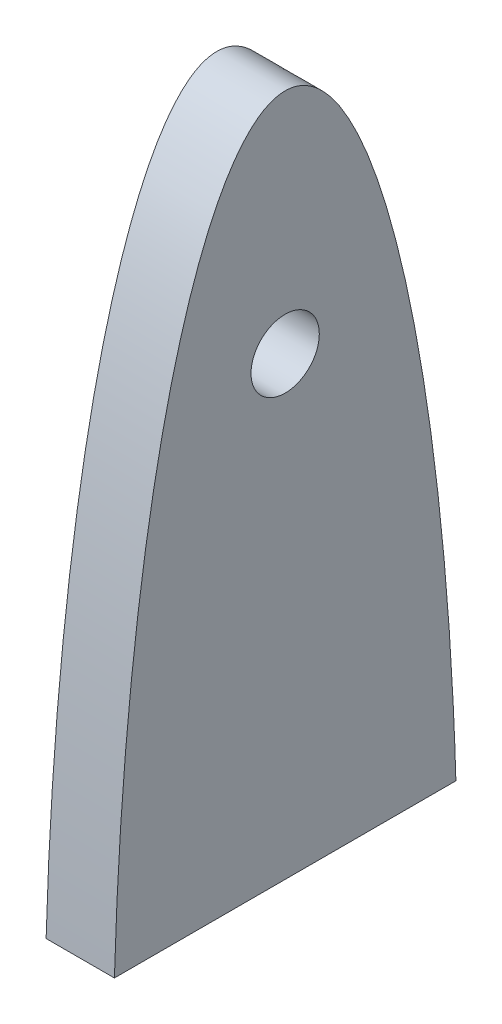
ISO-10303-21;
HEADER;
FILE_DESCRIPTION(('STEP AP214'),'2;1');
FILE_NAME('part.step','',(''),(''),'','','');
FILE_SCHEMA(('AUTOMOTIVE_DESIGN { 1 0 10303 214 1 1 1 1 }'));
ENDSEC;
DATA;
#1=APPLICATION_CONTEXT('core data for automotive mechanical design processes');
#2=APPLICATION_PROTOCOL_DEFINITION('international standard','automotive_design',2000,#1);
#3=PRODUCT_CONTEXT('',#1,'mechanical');
#4=PRODUCT('Part','Part','',(#3));
#5=PRODUCT_RELATED_PRODUCT_CATEGORY('part','',(#4));
#6=PRODUCT_DEFINITION_FORMATION('','',#4);
#7=PRODUCT_DEFINITION_CONTEXT('part definition',#1,'design');
#8=PRODUCT_DEFINITION('design','',#6,#7);
#9=PRODUCT_DEFINITION_SHAPE('','',#8);
#10=(LENGTH_UNIT() NAMED_UNIT(*) SI_UNIT(.MILLI.,.METRE.));
#11=(NAMED_UNIT(*) PLANE_ANGLE_UNIT() SI_UNIT($,.RADIAN.));
#12=(NAMED_UNIT(*) SI_UNIT($,.STERADIAN.) SOLID_ANGLE_UNIT());
#13=UNCERTAINTY_MEASURE_WITH_UNIT(LENGTH_MEASURE(1.E-05),#10,'distance_accuracy_value','');
#14=(GEOMETRIC_REPRESENTATION_CONTEXT(3) GLOBAL_UNCERTAINTY_ASSIGNED_CONTEXT((#13)) GLOBAL_UNIT_ASSIGNED_CONTEXT((#10,
#11,#12)) REPRESENTATION_CONTEXT('',''));
#15=CARTESIAN_POINT('',(0.,0.,0.));
#16=DIRECTION('',(0.,0.,1.));
#17=DIRECTION('',(1.,0.,0.));
#18=AXIS2_PLACEMENT_3D('',#15,#16,#17);
#19=CARTESIAN_POINT('',(3.,0.,7.5));
#20=CARTESIAN_POINT('',(3.,250.,0.));
#21=CARTESIAN_POINT('',(3.,0.,-7.5));
#22=(BOUNDED_CURVE() B_SPLINE_CURVE(2,(#19,#20,#21),.UNSPECIFIED.,.F.,
.F.) B_SPLINE_CURVE_WITH_KNOTS((3,3),(0.,1.),
.UNSPECIFIED.) CURVE() GEOMETRIC_REPRESENTATION_ITEM() RATIONAL_B_SPLINE_CURVE((1.,
0.136363636363636,1.)) REPRESENTATION_ITEM(''));
#23=DIRECTION('',(-1.,0.,0.));
#24=VECTOR('',#23,1.);
#25=SURFACE_OF_LINEAR_EXTRUSION('',#22,#24);
#26=CARTESIAN_POINT('',(0.,0.,7.5));
#27=CARTESIAN_POINT('',(0.,250.,0.));
#28=CARTESIAN_POINT('',(0.,0.,-7.5));
#29=(BOUNDED_CURVE() B_SPLINE_CURVE(2,(#26,#27,#28),.UNSPECIFIED.,.F.,
.F.) B_SPLINE_CURVE_WITH_KNOTS((3,3),(0.,1.),
.UNSPECIFIED.) CURVE() GEOMETRIC_REPRESENTATION_ITEM() RATIONAL_B_SPLINE_CURVE((1.,
0.136363636363636,1.)) REPRESENTATION_ITEM(''));
#30=CARTESIAN_POINT('',(0.,0.,7.5));
#31=VERTEX_POINT('',#30);
#32=CARTESIAN_POINT('',(0.,0.,-7.5));
#33=VERTEX_POINT('',#32);
#34=EDGE_CURVE('E71',#31,#33,#29,.T.);
#35=ORIENTED_EDGE('',*,*,#34,.F.);
#36=DIRECTION('',(-1.,0.,0.));
#37=VECTOR('',#36,1.);
#38=CARTESIAN_POINT('',(3.,0.,7.5));
#39=LINE('',#38,#37);
#40=CARTESIAN_POINT('',(3.,0.,7.5));
#41=VERTEX_POINT('',#40);
#42=EDGE_CURVE('E11',#41,#31,#39,.T.);
#43=ORIENTED_EDGE('',*,*,#42,.F.);
#44=CARTESIAN_POINT('',(3.,0.,-7.5));
#45=VERTEX_POINT('',#44);
#46=EDGE_CURVE('E72',#41,#45,#22,.T.);
#47=ORIENTED_EDGE('',*,*,#46,.T.);
#48=DIRECTION('',(-1.,0.,0.));
#49=VECTOR('',#48,1.);
#50=CARTESIAN_POINT('',(3.,0.,-7.5));
#51=LINE('',#50,#49);
#52=EDGE_CURVE('E51',#45,#33,#51,.T.);
#53=ORIENTED_EDGE('',*,*,#52,.T.);
#54=EDGE_LOOP('',(#35,#43,#47,#53));
#55=FACE_BOUND('',#54,.T.);
#56=ADVANCED_FACE('F41',(#55),#25,.T.);
#57=CARTESIAN_POINT('',(3.,20.,0.));
#58=DIRECTION('',(-1.,0.,0.));
#59=DIRECTION('',(0.,0.,1.));
#60=AXIS2_PLACEMENT_3D('',#57,#58,#59);
#61=CYLINDRICAL_SURFACE('',#60,1.5);
#62=CARTESIAN_POINT('',(3.,20.,0.));
#63=DIRECTION('',(1.,0.,0.));
#64=DIRECTION('',(0.,0.,-1.));
#65=AXIS2_PLACEMENT_3D('',#62,#63,#64);
#66=CIRCLE('',#65,1.5);
#67=CARTESIAN_POINT('',(3.,20.,-1.5));
#68=VERTEX_POINT('',#67);
#69=EDGE_CURVE('E78',#68,#68,#66,.T.);
#70=ORIENTED_EDGE('',*,*,#69,.T.);
#71=EDGE_LOOP('',(#70));
#72=FACE_BOUND('',#71,.T.);
#73=CARTESIAN_POINT('',(0.,20.,0.));
#74=DIRECTION('',(1.,0.,0.));
#75=DIRECTION('',(0.,0.,-1.));
#76=AXIS2_PLACEMENT_3D('',#73,#74,#75);
#77=CIRCLE('',#76,1.5);
#78=CARTESIAN_POINT('',(0.,20.,-1.5));
#79=VERTEX_POINT('',#78);
#80=EDGE_CURVE('E82',#79,#79,#77,.T.);
#81=ORIENTED_EDGE('',*,*,#80,.F.);
#82=EDGE_LOOP('',(#81));
#83=FACE_BOUND('',#82,.T.);
#84=ADVANCED_FACE('F43',(#72,#83),#61,.F.);
#85=CARTESIAN_POINT('',(3.,0.,0.));
#86=DIRECTION('',(0.,1.,0.));
#87=DIRECTION('',(0.,0.,1.));
#88=AXIS2_PLACEMENT_3D('',#85,#86,#87);
#89=PLANE('',#88);
#90=DIRECTION('',(0.,0.,-1.));
#91=VECTOR('',#90,1.);
#92=CARTESIAN_POINT('',(0.,0.,0.));
#93=LINE('',#92,#91);
#94=EDGE_CURVE('E74',#31,#33,#93,.T.);
#95=ORIENTED_EDGE('',*,*,#94,.T.);
#96=ORIENTED_EDGE('',*,*,#52,.F.);
#97=DIRECTION('',(0.,0.,-1.));
#98=VECTOR('',#97,1.);
#99=CARTESIAN_POINT('',(3.,0.,0.));
#100=LINE('',#99,#98);
#101=EDGE_CURVE('E58',#41,#45,#100,.T.);
#102=ORIENTED_EDGE('',*,*,#101,.F.);
#103=ORIENTED_EDGE('',*,*,#42,.T.);
#104=EDGE_LOOP('',(#95,#96,#102,#103));
#105=FACE_BOUND('',#104,.T.);
#106=ADVANCED_FACE('F75',(#105),#89,.F.);
#107=CARTESIAN_POINT('',(3.,0.,0.));
#108=DIRECTION('',(1.,0.,0.));
#109=DIRECTION('',(0.,0.,-1.));
#110=AXIS2_PLACEMENT_3D('',#107,#108,#109);
#111=PLANE('',#110);
#112=ORIENTED_EDGE('',*,*,#69,.F.);
#113=EDGE_LOOP('',(#112));
#114=FACE_BOUND('',#113,.T.);
#115=ORIENTED_EDGE('',*,*,#46,.F.);
#116=ORIENTED_EDGE('',*,*,#101,.T.);
#117=EDGE_LOOP('',(#115,#116));
#118=FACE_BOUND('',#117,.T.);
#119=ADVANCED_FACE('F107',(#114,#118),#111,.T.);
#120=CARTESIAN_POINT('',(0.,0.,0.));
#121=DIRECTION('',(1.,0.,0.));
#122=DIRECTION('',(0.,0.,-1.));
#123=AXIS2_PLACEMENT_3D('',#120,#121,#122);
#124=PLANE('',#123);
#125=ORIENTED_EDGE('',*,*,#80,.T.);
#126=EDGE_LOOP('',(#125));
#127=FACE_BOUND('',#126,.T.);
#128=ORIENTED_EDGE('',*,*,#34,.T.);
#129=ORIENTED_EDGE('',*,*,#94,.F.);
#130=EDGE_LOOP('',(#128,#129));
#131=FACE_BOUND('',#130,.T.);
#132=ADVANCED_FACE('F80',(#127,#131),#124,.F.);
#133=CLOSED_SHELL('',(#56,#84,#106,#119,#132));
#134=MANIFOLD_SOLID_BREP('B2',#133);
#135=ADVANCED_BREP_SHAPE_REPRESENTATION('',(#18,#134),#14);
#136=SHAPE_DEFINITION_REPRESENTATION(#9,#135);
ENDSEC;
END-ISO-10303-21;
